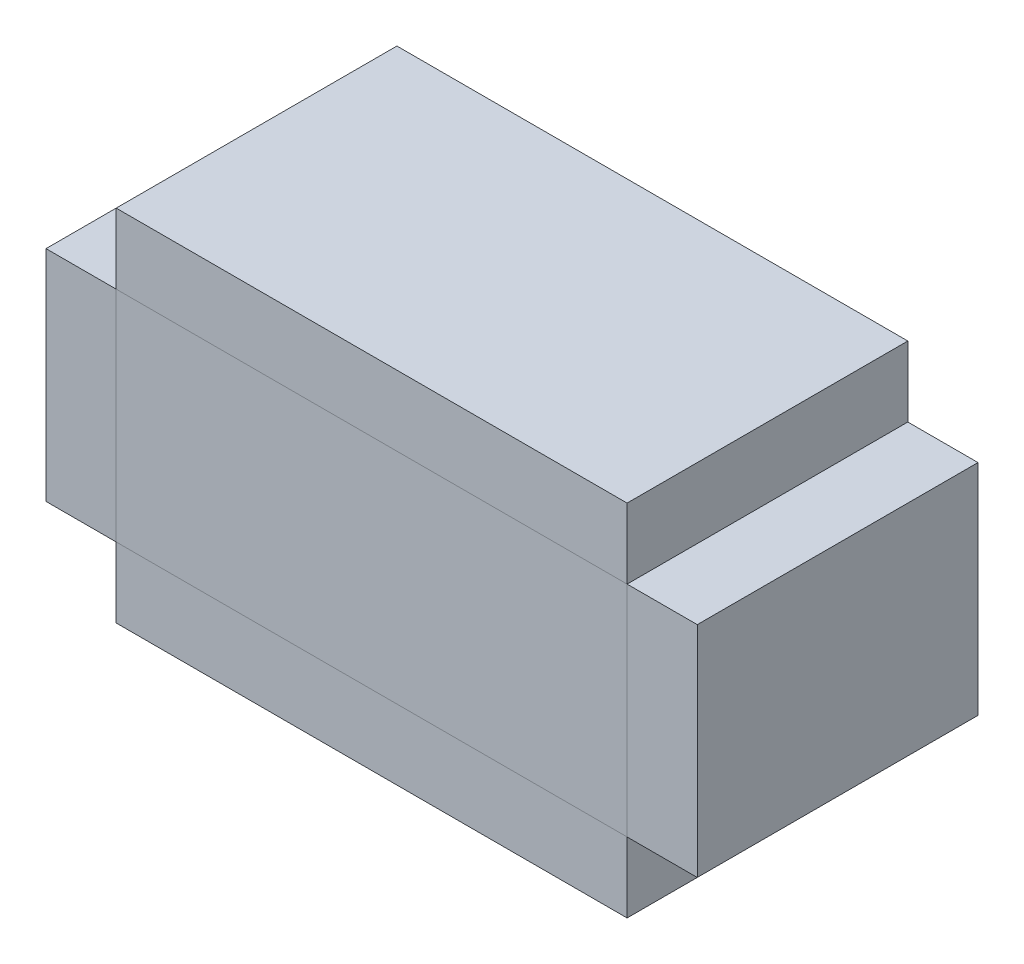
ISO-10303-21;
HEADER;
FILE_DESCRIPTION(('STEP AP214'),'2;1');
FILE_NAME('part.step','',(''),(''),'','','');
FILE_SCHEMA(('AUTOMOTIVE_DESIGN { 1 0 10303 214 1 1 1 1 }'));
ENDSEC;
DATA;
#1=APPLICATION_CONTEXT('core data for automotive mechanical design processes');
#2=APPLICATION_PROTOCOL_DEFINITION('international standard','automotive_design',2000,#1);
#3=PRODUCT_CONTEXT('',#1,'mechanical');
#4=PRODUCT('Part','Part','',(#3));
#5=PRODUCT_RELATED_PRODUCT_CATEGORY('part','',(#4));
#6=PRODUCT_DEFINITION_FORMATION('','',#4);
#7=PRODUCT_DEFINITION_CONTEXT('part definition',#1,'design');
#8=PRODUCT_DEFINITION('design','',#6,#7);
#9=PRODUCT_DEFINITION_SHAPE('','',#8);
#10=(LENGTH_UNIT() NAMED_UNIT(*) SI_UNIT(.MILLI.,.METRE.));
#11=(NAMED_UNIT(*) PLANE_ANGLE_UNIT() SI_UNIT($,.RADIAN.));
#12=(NAMED_UNIT(*) SI_UNIT($,.STERADIAN.) SOLID_ANGLE_UNIT());
#13=UNCERTAINTY_MEASURE_WITH_UNIT(LENGTH_MEASURE(1.E-05),#10,'distance_accuracy_value','');
#14=(GEOMETRIC_REPRESENTATION_CONTEXT(3) GLOBAL_UNCERTAINTY_ASSIGNED_CONTEXT((#13)) GLOBAL_UNIT_ASSIGNED_CONTEXT((#10,
#11,#12)) REPRESENTATION_CONTEXT('',''));
#15=CARTESIAN_POINT('',(0.,0.,0.));
#16=DIRECTION('',(0.,0.,1.));
#17=DIRECTION('',(1.,0.,0.));
#18=AXIS2_PLACEMENT_3D('',#15,#16,#17);
#19=CARTESIAN_POINT('',(0.,-15.24,74.2026103680753));
#20=DIRECTION('',(0.,-1.,0.));
#21=DIRECTION('',(0.,0.,-1.));
#22=AXIS2_PLACEMENT_3D('',#19,#20,#21);
#23=PLANE('',#22);
#24=DIRECTION('',(0.,0.,-1.));
#25=VECTOR('',#24,1.);
#26=CARTESIAN_POINT('',(-28.8925,-15.24,74.2026103680753));
#27=LINE('',#26,#25);
#28=CARTESIAN_POINT('',(-28.8925,-15.24,15.875));
#29=VERTEX_POINT('',#28);
#30=CARTESIAN_POINT('',(-28.8925,-15.24,-15.875));
#31=VERTEX_POINT('',#30);
#32=EDGE_CURVE('E120',#29,#31,#27,.T.);
#33=ORIENTED_EDGE('',*,*,#32,.F.);
#34=DIRECTION('',(1.,0.,0.));
#35=VECTOR('',#34,1.);
#36=CARTESIAN_POINT('',(0.,-15.24,15.875));
#37=LINE('',#36,#35);
#38=CARTESIAN_POINT('',(28.8925,-15.24,15.875));
#39=VERTEX_POINT('',#38);
#40=EDGE_CURVE('E65',#29,#39,#37,.T.);
#41=ORIENTED_EDGE('',*,*,#40,.T.);
#42=DIRECTION('',(0.,0.,-1.));
#43=VECTOR('',#42,1.);
#44=CARTESIAN_POINT('',(28.8925,-15.24,74.2026103680753));
#45=LINE('',#44,#43);
#46=CARTESIAN_POINT('',(28.8925,-15.24,-15.875));
#47=VERTEX_POINT('',#46);
#48=EDGE_CURVE('E95',#39,#47,#45,.T.);
#49=ORIENTED_EDGE('',*,*,#48,.T.);
#50=DIRECTION('',(-1.,0.,0.));
#51=VECTOR('',#50,1.);
#52=CARTESIAN_POINT('',(0.,-15.24,-15.875));
#53=LINE('',#52,#51);
#54=EDGE_CURVE('E98',#47,#31,#53,.T.);
#55=ORIENTED_EDGE('',*,*,#54,.T.);
#56=EDGE_LOOP('',(#33,#41,#49,#55));
#57=FACE_BOUND('',#56,.T.);
#58=ADVANCED_FACE('F58',(#57),#23,.F.);
#59=CARTESIAN_POINT('',(-28.8925,0.,74.2026103680753));
#60=DIRECTION('',(1.,0.,0.));
#61=DIRECTION('',(0.,0.,-1.));
#62=AXIS2_PLACEMENT_3D('',#59,#60,#61);
#63=PLANE('',#62);
#64=DIRECTION('',(0.,0.,-1.));
#65=VECTOR('',#64,1.);
#66=CARTESIAN_POINT('',(-28.8925,-23.1775,74.2026103680753));
#67=LINE('',#66,#65);
#68=CARTESIAN_POINT('',(-28.8925,-23.1775,15.875));
#69=VERTEX_POINT('',#68);
#70=CARTESIAN_POINT('',(-28.8925,-23.1775,-15.875));
#71=VERTEX_POINT('',#70);
#72=EDGE_CURVE('E123',#69,#71,#67,.T.);
#73=ORIENTED_EDGE('',*,*,#72,.F.);
#74=DIRECTION('',(0.,1.,0.));
#75=VECTOR('',#74,1.);
#76=CARTESIAN_POINT('',(-28.8925,0.,15.875));
#77=LINE('',#76,#75);
#78=EDGE_CURVE('E72',#69,#29,#77,.T.);
#79=ORIENTED_EDGE('',*,*,#78,.T.);
#80=ORIENTED_EDGE('',*,*,#32,.T.);
#81=DIRECTION('',(0.,-1.,0.));
#82=VECTOR('',#81,1.);
#83=CARTESIAN_POINT('',(-28.8925,0.,-15.875));
#84=LINE('',#83,#82);
#85=EDGE_CURVE('E102',#31,#71,#84,.T.);
#86=ORIENTED_EDGE('',*,*,#85,.T.);
#87=EDGE_LOOP('',(#73,#79,#80,#86));
#88=FACE_BOUND('',#87,.T.);
#89=ADVANCED_FACE('F129',(#88),#63,.F.);
#90=CARTESIAN_POINT('',(0.,-23.1775,74.2026103680753));
#91=DIRECTION('',(0.,1.,0.));
#92=DIRECTION('',(-1.,0.,0.));
#93=AXIS2_PLACEMENT_3D('',#90,#91,#92);
#94=PLANE('',#93);
#95=DIRECTION('',(0.,0.,-1.));
#96=VECTOR('',#95,1.);
#97=CARTESIAN_POINT('',(28.8925,-23.1775,74.2026103680753));
#98=LINE('',#97,#96);
#99=CARTESIAN_POINT('',(28.8925,-23.1775,15.875));
#100=VERTEX_POINT('',#99);
#101=CARTESIAN_POINT('',(28.8925,-23.1775,-15.875));
#102=VERTEX_POINT('',#101);
#103=EDGE_CURVE('E101',#100,#102,#98,.T.);
#104=ORIENTED_EDGE('',*,*,#103,.F.);
#105=DIRECTION('',(-1.,0.,0.));
#106=VECTOR('',#105,1.);
#107=CARTESIAN_POINT('',(0.,-23.1775,15.875));
#108=LINE('',#107,#106);
#109=EDGE_CURVE('E122',#100,#69,#108,.T.);
#110=ORIENTED_EDGE('',*,*,#109,.T.);
#111=ORIENTED_EDGE('',*,*,#72,.T.);
#112=DIRECTION('',(1.,0.,0.));
#113=VECTOR('',#112,1.);
#114=CARTESIAN_POINT('',(0.,-23.1775,-15.875));
#115=LINE('',#114,#113);
#116=EDGE_CURVE('E114',#71,#102,#115,.T.);
#117=ORIENTED_EDGE('',*,*,#116,.T.);
#118=EDGE_LOOP('',(#104,#110,#111,#117));
#119=FACE_BOUND('',#118,.T.);
#120=ADVANCED_FACE('F127',(#119),#94,.F.);
#121=CARTESIAN_POINT('',(28.8925,0.,74.2026103680753));
#122=DIRECTION('',(1.,0.,0.));
#123=DIRECTION('',(0.,0.,-1.));
#124=AXIS2_PLACEMENT_3D('',#121,#122,#123);
#125=PLANE('',#124);
#126=DIRECTION('',(0.,1.,0.));
#127=VECTOR('',#126,1.);
#128=CARTESIAN_POINT('',(28.8925,0.,15.875));
#129=LINE('',#128,#127);
#130=EDGE_CURVE('E12',#100,#39,#129,.T.);
#131=ORIENTED_EDGE('',*,*,#130,.F.);
#132=ORIENTED_EDGE('',*,*,#103,.T.);
#133=DIRECTION('',(0.,-1.,0.));
#134=VECTOR('',#133,1.);
#135=CARTESIAN_POINT('',(28.8925,0.,-15.875));
#136=LINE('',#135,#134);
#137=EDGE_CURVE('E108',#47,#102,#136,.T.);
#138=ORIENTED_EDGE('',*,*,#137,.F.);
#139=ORIENTED_EDGE('',*,*,#48,.F.);
#140=EDGE_LOOP('',(#131,#132,#138,#139));
#141=FACE_BOUND('',#140,.T.);
#142=ADVANCED_FACE('F111',(#141),#125,.T.);
#143=CARTESIAN_POINT('',(0.,0.,-15.875));
#144=DIRECTION('',(0.,0.,-1.));
#145=DIRECTION('',(-1.,0.,0.));
#146=AXIS2_PLACEMENT_3D('',#143,#144,#145);
#147=PLANE('',#146);
#148=ORIENTED_EDGE('',*,*,#54,.F.);
#149=ORIENTED_EDGE('',*,*,#137,.T.);
#150=ORIENTED_EDGE('',*,*,#116,.F.);
#151=ORIENTED_EDGE('',*,*,#85,.F.);
#152=EDGE_LOOP('',(#148,#149,#150,#151));
#153=FACE_BOUND('',#152,.T.);
#154=ADVANCED_FACE('F106',(#153),#147,.T.);
#155=CARTESIAN_POINT('',(0.,0.,15.875));
#156=DIRECTION('',(0.,0.,-1.));
#157=DIRECTION('',(-1.,0.,0.));
#158=AXIS2_PLACEMENT_3D('',#155,#156,#157);
#159=PLANE('',#158);
#160=ORIENTED_EDGE('',*,*,#78,.F.);
#161=ORIENTED_EDGE('',*,*,#109,.F.);
#162=ORIENTED_EDGE('',*,*,#130,.T.);
#163=ORIENTED_EDGE('',*,*,#40,.F.);
#164=EDGE_LOOP('',(#160,#161,#162,#163));
#165=FACE_BOUND('',#164,.T.);
#166=ADVANCED_FACE('F145',(#165),#159,.F.);
#167=CLOSED_SHELL('',(#58,#89,#120,#142,#154,#166));
#168=MANIFOLD_SOLID_BREP('B2',#167);
#169=CARTESIAN_POINT('',(0.,0.,-15.875));
#170=DIRECTION('',(0.,0.,-1.));
#171=DIRECTION('',(-1.,0.,0.));
#172=AXIS2_PLACEMENT_3D('',#169,#170,#171);
#173=PLANE('',#172);
#174=DIRECTION('',(0.,-1.,0.));
#175=VECTOR('',#174,1.);
#176=CARTESIAN_POINT('',(-36.83,0.,-15.875));
#177=LINE('',#176,#175);
#178=CARTESIAN_POINT('',(-36.83,9.525,-15.875));
#179=VERTEX_POINT('',#178);
#180=CARTESIAN_POINT('',(-36.83,-15.24,-15.875));
#181=VERTEX_POINT('',#180);
#182=EDGE_CURVE('E250',#179,#181,#177,.T.);
#183=ORIENTED_EDGE('',*,*,#182,.F.);
#184=DIRECTION('',(-1.,0.,0.));
#185=VECTOR('',#184,1.);
#186=CARTESIAN_POINT('',(0.,9.525,-15.875));
#187=LINE('',#186,#185);
#188=CARTESIAN_POINT('',(-28.8925,9.525,-15.875));
#189=VERTEX_POINT('',#188);
#190=EDGE_CURVE('E256',#189,#179,#187,.T.);
#191=ORIENTED_EDGE('',*,*,#190,.F.);
#192=DIRECTION('',(0.,1.,0.));
#193=VECTOR('',#192,1.);
#194=CARTESIAN_POINT('',(-28.8925,0.,-15.875));
#195=LINE('',#194,#193);
#196=CARTESIAN_POINT('',(-28.8925,-15.24,-15.875));
#197=VERTEX_POINT('',#196);
#198=EDGE_CURVE('E262',#197,#189,#195,.T.);
#199=ORIENTED_EDGE('',*,*,#198,.F.);
#200=DIRECTION('',(-1.,0.,0.));
#201=VECTOR('',#200,1.);
#202=CARTESIAN_POINT('',(0.,-15.24,-15.875));
#203=LINE('',#202,#201);
#204=EDGE_CURVE('E254',#197,#181,#203,.T.);
#205=ORIENTED_EDGE('',*,*,#204,.T.);
#206=EDGE_LOOP('',(#183,#191,#199,#205));
#207=FACE_BOUND('',#206,.T.);
#208=ADVANCED_FACE('F207',(#207),#173,.T.);
#209=CARTESIAN_POINT('',(0.,9.525,74.2026103680753));
#210=DIRECTION('',(0.,-1.,0.));
#211=DIRECTION('',(0.,0.,-1.));
#212=AXIS2_PLACEMENT_3D('',#209,#210,#211);
#213=PLANE('',#212);
#214=DIRECTION('',(0.,0.,-1.));
#215=VECTOR('',#214,1.);
#216=CARTESIAN_POINT('',(-36.83,9.525,74.2026103680753));
#217=LINE('',#216,#215);
#218=CARTESIAN_POINT('',(-36.83,9.525,15.875));
#219=VERTEX_POINT('',#218);
#220=EDGE_CURVE('E246',#219,#179,#217,.T.);
#221=ORIENTED_EDGE('',*,*,#220,.F.);
#222=DIRECTION('',(1.,0.,0.));
#223=VECTOR('',#222,1.);
#224=CARTESIAN_POINT('',(0.,9.525,15.875));
#225=LINE('',#224,#223);
#226=CARTESIAN_POINT('',(-28.8925,9.525,15.875));
#227=VERTEX_POINT('',#226);
#228=EDGE_CURVE('E211',#219,#227,#225,.T.);
#229=ORIENTED_EDGE('',*,*,#228,.T.);
#230=DIRECTION('',(0.,0.,-1.));
#231=VECTOR('',#230,1.);
#232=CARTESIAN_POINT('',(-28.8925,9.525,74.2026103680753));
#233=LINE('',#232,#231);
#234=EDGE_CURVE('E253',#227,#189,#233,.T.);
#235=ORIENTED_EDGE('',*,*,#234,.T.);
#236=ORIENTED_EDGE('',*,*,#190,.T.);
#237=EDGE_LOOP('',(#221,#229,#235,#236));
#238=FACE_BOUND('',#237,.T.);
#239=ADVANCED_FACE('F257',(#238),#213,.F.);
#240=CARTESIAN_POINT('',(-28.8925,0.,74.2026103680753));
#241=DIRECTION('',(-1.,0.,0.));
#242=DIRECTION('',(0.,-1.,0.));
#243=AXIS2_PLACEMENT_3D('',#240,#241,#242);
#244=PLANE('',#243);
#245=ORIENTED_EDGE('',*,*,#234,.F.);
#246=DIRECTION('',(0.,-1.,0.));
#247=VECTOR('',#246,1.);
#248=CARTESIAN_POINT('',(-28.8925,0.,15.875));
#249=LINE('',#248,#247);
#250=CARTESIAN_POINT('',(-28.8925,-15.24,15.875));
#251=VERTEX_POINT('',#250);
#252=EDGE_CURVE('E277',#227,#251,#249,.T.);
#253=ORIENTED_EDGE('',*,*,#252,.T.);
#254=DIRECTION('',(0.,0.,-1.));
#255=VECTOR('',#254,1.);
#256=CARTESIAN_POINT('',(-28.8925,-15.24,74.2026103680753));
#257=LINE('',#256,#255);
#258=EDGE_CURVE('E272',#251,#197,#257,.T.);
#259=ORIENTED_EDGE('',*,*,#258,.T.);
#260=ORIENTED_EDGE('',*,*,#198,.T.);
#261=EDGE_LOOP('',(#245,#253,#259,#260));
#262=FACE_BOUND('',#261,.T.);
#263=ADVANCED_FACE('F276',(#262),#244,.F.);
#264=CARTESIAN_POINT('',(0.,-15.24,74.2026103680753));
#265=DIRECTION('',(0.,-1.,0.));
#266=DIRECTION('',(0.,0.,-1.));
#267=AXIS2_PLACEMENT_3D('',#264,#265,#266);
#268=PLANE('',#267);
#269=DIRECTION('',(1.,0.,0.));
#270=VECTOR('',#269,1.);
#271=CARTESIAN_POINT('',(0.,-15.24,15.875));
#272=LINE('',#271,#270);
#273=CARTESIAN_POINT('',(-36.83,-15.24,15.875));
#274=VERTEX_POINT('',#273);
#275=EDGE_CURVE('E216',#274,#251,#272,.T.);
#276=ORIENTED_EDGE('',*,*,#275,.F.);
#277=DIRECTION('',(0.,0.,-1.));
#278=VECTOR('',#277,1.);
#279=CARTESIAN_POINT('',(-36.83,-15.24,74.2026103680753));
#280=LINE('',#279,#278);
#281=EDGE_CURVE('E270',#274,#181,#280,.T.);
#282=ORIENTED_EDGE('',*,*,#281,.T.);
#283=ORIENTED_EDGE('',*,*,#204,.F.);
#284=ORIENTED_EDGE('',*,*,#258,.F.);
#285=EDGE_LOOP('',(#276,#282,#283,#284));
#286=FACE_BOUND('',#285,.T.);
#287=ADVANCED_FACE('F279',(#286),#268,.T.);
#288=CARTESIAN_POINT('',(-36.83,0.,74.2026103680753));
#289=DIRECTION('',(1.,0.,0.));
#290=DIRECTION('',(0.,0.,-1.));
#291=AXIS2_PLACEMENT_3D('',#288,#289,#290);
#292=PLANE('',#291);
#293=ORIENTED_EDGE('',*,*,#281,.F.);
#294=DIRECTION('',(0.,1.,0.));
#295=VECTOR('',#294,1.);
#296=CARTESIAN_POINT('',(-36.83,0.,15.875));
#297=LINE('',#296,#295);
#298=EDGE_CURVE('E56',#274,#219,#297,.T.);
#299=ORIENTED_EDGE('',*,*,#298,.T.);
#300=ORIENTED_EDGE('',*,*,#220,.T.);
#301=ORIENTED_EDGE('',*,*,#182,.T.);
#302=EDGE_LOOP('',(#293,#299,#300,#301));
#303=FACE_BOUND('',#302,.T.);
#304=ADVANCED_FACE('F209',(#303),#292,.F.);
#305=CARTESIAN_POINT('',(0.,0.,15.875));
#306=DIRECTION('',(0.,0.,-1.));
#307=DIRECTION('',(-1.,0.,0.));
#308=AXIS2_PLACEMENT_3D('',#305,#306,#307);
#309=PLANE('',#308);
#310=ORIENTED_EDGE('',*,*,#275,.T.);
#311=ORIENTED_EDGE('',*,*,#252,.F.);
#312=ORIENTED_EDGE('',*,*,#228,.F.);
#313=ORIENTED_EDGE('',*,*,#298,.F.);
#314=EDGE_LOOP('',(#310,#311,#312,#313));
#315=FACE_BOUND('',#314,.T.);
#316=ADVANCED_FACE('F287',(#315),#309,.F.);
#317=CLOSED_SHELL('',(#208,#239,#263,#287,#304,#316));
#318=MANIFOLD_SOLID_BREP('B6',#317);
#319=CARTESIAN_POINT('',(0.,9.525,74.2026103680753));
#320=DIRECTION('',(0.,1.,0.));
#321=DIRECTION('',(0.,0.,1.));
#322=AXIS2_PLACEMENT_3D('',#319,#320,#321);
#323=PLANE('',#322);
#324=DIRECTION('',(0.,0.,-1.));
#325=VECTOR('',#324,1.);
#326=CARTESIAN_POINT('',(28.8925,9.525,74.2026103680753));
#327=LINE('',#326,#325);
#328=CARTESIAN_POINT('',(28.8925,9.525,15.875));
#329=VERTEX_POINT('',#328);
#330=CARTESIAN_POINT('',(28.8925,9.525,-15.875));
#331=VERTEX_POINT('',#330);
#332=EDGE_CURVE('E418',#329,#331,#327,.T.);
#333=ORIENTED_EDGE('',*,*,#332,.F.);
#334=DIRECTION('',(-1.,0.,0.));
#335=VECTOR('',#334,1.);
#336=CARTESIAN_POINT('',(0.,9.525,15.875));
#337=LINE('',#336,#335);
#338=CARTESIAN_POINT('',(-28.8925,9.525,15.875));
#339=VERTEX_POINT('',#338);
#340=EDGE_CURVE('E363',#329,#339,#337,.T.);
#341=ORIENTED_EDGE('',*,*,#340,.T.);
#342=DIRECTION('',(0.,0.,-1.));
#343=VECTOR('',#342,1.);
#344=CARTESIAN_POINT('',(-28.8925,9.525,74.2026103680753));
#345=LINE('',#344,#343);
#346=CARTESIAN_POINT('',(-28.8925,9.525,-15.875));
#347=VERTEX_POINT('',#346);
#348=EDGE_CURVE('E393',#339,#347,#345,.T.);
#349=ORIENTED_EDGE('',*,*,#348,.T.);
#350=DIRECTION('',(1.,0.,0.));
#351=VECTOR('',#350,1.);
#352=CARTESIAN_POINT('',(0.,9.525,-15.875));
#353=LINE('',#352,#351);
#354=EDGE_CURVE('E396',#347,#331,#353,.T.);
#355=ORIENTED_EDGE('',*,*,#354,.T.);
#356=EDGE_LOOP('',(#333,#341,#349,#355));
#357=FACE_BOUND('',#356,.T.);
#358=ADVANCED_FACE('F356',(#357),#323,.F.);
#359=CARTESIAN_POINT('',(28.8925,0.,74.2026103680753));
#360=DIRECTION('',(-1.,0.,0.));
#361=DIRECTION('',(0.,0.,1.));
#362=AXIS2_PLACEMENT_3D('',#359,#360,#361);
#363=PLANE('',#362);
#364=DIRECTION('',(0.,0.,-1.));
#365=VECTOR('',#364,1.);
#366=CARTESIAN_POINT('',(28.8925,17.4625,74.2026103680753));
#367=LINE('',#366,#365);
#368=CARTESIAN_POINT('',(28.8925,17.4625,15.875));
#369=VERTEX_POINT('',#368);
#370=CARTESIAN_POINT('',(28.8925,17.4625,-15.875));
#371=VERTEX_POINT('',#370);
#372=EDGE_CURVE('E421',#369,#371,#367,.T.);
#373=ORIENTED_EDGE('',*,*,#372,.F.);
#374=DIRECTION('',(0.,-1.,0.));
#375=VECTOR('',#374,1.);
#376=CARTESIAN_POINT('',(28.8925,0.,15.875));
#377=LINE('',#376,#375);
#378=EDGE_CURVE('E370',#369,#329,#377,.T.);
#379=ORIENTED_EDGE('',*,*,#378,.T.);
#380=ORIENTED_EDGE('',*,*,#332,.T.);
#381=DIRECTION('',(0.,1.,0.));
#382=VECTOR('',#381,1.);
#383=CARTESIAN_POINT('',(28.8925,0.,-15.875));
#384=LINE('',#383,#382);
#385=EDGE_CURVE('E400',#331,#371,#384,.T.);
#386=ORIENTED_EDGE('',*,*,#385,.T.);
#387=EDGE_LOOP('',(#373,#379,#380,#386));
#388=FACE_BOUND('',#387,.T.);
#389=ADVANCED_FACE('F427',(#388),#363,.F.);
#390=CARTESIAN_POINT('',(0.,17.4625,74.2026103680753));
#391=DIRECTION('',(0.,-1.,0.));
#392=DIRECTION('',(0.,0.,-1.));
#393=AXIS2_PLACEMENT_3D('',#390,#391,#392);
#394=PLANE('',#393);
#395=DIRECTION('',(0.,0.,-1.));
#396=VECTOR('',#395,1.);
#397=CARTESIAN_POINT('',(-28.8925,17.4625,74.2026103680753));
#398=LINE('',#397,#396);
#399=CARTESIAN_POINT('',(-28.8925,17.4625,15.875));
#400=VERTEX_POINT('',#399);
#401=CARTESIAN_POINT('',(-28.8925,17.4625,-15.875));
#402=VERTEX_POINT('',#401);
#403=EDGE_CURVE('E399',#400,#402,#398,.T.);
#404=ORIENTED_EDGE('',*,*,#403,.F.);
#405=DIRECTION('',(1.,0.,0.));
#406=VECTOR('',#405,1.);
#407=CARTESIAN_POINT('',(0.,17.4625,15.875));
#408=LINE('',#407,#406);
#409=EDGE_CURVE('E420',#400,#369,#408,.T.);
#410=ORIENTED_EDGE('',*,*,#409,.T.);
#411=ORIENTED_EDGE('',*,*,#372,.T.);
#412=DIRECTION('',(-1.,0.,0.));
#413=VECTOR('',#412,1.);
#414=CARTESIAN_POINT('',(0.,17.4625,-15.875));
#415=LINE('',#414,#413);
#416=EDGE_CURVE('E412',#371,#402,#415,.T.);
#417=ORIENTED_EDGE('',*,*,#416,.T.);
#418=EDGE_LOOP('',(#404,#410,#411,#417));
#419=FACE_BOUND('',#418,.T.);
#420=ADVANCED_FACE('F425',(#419),#394,.F.);
#421=CARTESIAN_POINT('',(-28.8925,0.,74.2026103680753));
#422=DIRECTION('',(-1.,0.,0.));
#423=DIRECTION('',(0.,-1.,0.));
#424=AXIS2_PLACEMENT_3D('',#421,#422,#423);
#425=PLANE('',#424);
#426=DIRECTION('',(0.,-1.,0.));
#427=VECTOR('',#426,1.);
#428=CARTESIAN_POINT('',(-28.8925,0.,15.875));
#429=LINE('',#428,#427);
#430=EDGE_CURVE('E205',#400,#339,#429,.T.);
#431=ORIENTED_EDGE('',*,*,#430,.F.);
#432=ORIENTED_EDGE('',*,*,#403,.T.);
#433=DIRECTION('',(0.,1.,0.));
#434=VECTOR('',#433,1.);
#435=CARTESIAN_POINT('',(-28.8925,0.,-15.875));
#436=LINE('',#435,#434);
#437=EDGE_CURVE('E406',#347,#402,#436,.T.);
#438=ORIENTED_EDGE('',*,*,#437,.F.);
#439=ORIENTED_EDGE('',*,*,#348,.F.);
#440=EDGE_LOOP('',(#431,#432,#438,#439));
#441=FACE_BOUND('',#440,.T.);
#442=ADVANCED_FACE('F409',(#441),#425,.T.);
#443=CARTESIAN_POINT('',(0.,0.,-15.875));
#444=DIRECTION('',(0.,0.,-1.));
#445=DIRECTION('',(-1.,0.,0.));
#446=AXIS2_PLACEMENT_3D('',#443,#444,#445);
#447=PLANE('',#446);
#448=ORIENTED_EDGE('',*,*,#354,.F.);
#449=ORIENTED_EDGE('',*,*,#437,.T.);
#450=ORIENTED_EDGE('',*,*,#416,.F.);
#451=ORIENTED_EDGE('',*,*,#385,.F.);
#452=EDGE_LOOP('',(#448,#449,#450,#451));
#453=FACE_BOUND('',#452,.T.);
#454=ADVANCED_FACE('F404',(#453),#447,.T.);
#455=CARTESIAN_POINT('',(0.,0.,15.875));
#456=DIRECTION('',(0.,0.,-1.));
#457=DIRECTION('',(-1.,0.,0.));
#458=AXIS2_PLACEMENT_3D('',#455,#456,#457);
#459=PLANE('',#458);
#460=ORIENTED_EDGE('',*,*,#378,.F.);
#461=ORIENTED_EDGE('',*,*,#409,.F.);
#462=ORIENTED_EDGE('',*,*,#430,.T.);
#463=ORIENTED_EDGE('',*,*,#340,.F.);
#464=EDGE_LOOP('',(#460,#461,#462,#463));
#465=FACE_BOUND('',#464,.T.);
#466=ADVANCED_FACE('F443',(#465),#459,.F.);
#467=CLOSED_SHELL('',(#358,#389,#420,#442,#454,#466));
#468=MANIFOLD_SOLID_BREP('B50',#467);
#469=CARTESIAN_POINT('',(0.,0.,-15.875));
#470=DIRECTION('',(0.,0.,-1.));
#471=DIRECTION('',(-1.,0.,0.));
#472=AXIS2_PLACEMENT_3D('',#469,#470,#471);
#473=PLANE('',#472);
#474=DIRECTION('',(0.,1.,0.));
#475=VECTOR('',#474,1.);
#476=CARTESIAN_POINT('',(36.83,0.,-15.875));
#477=LINE('',#476,#475);
#478=CARTESIAN_POINT('',(36.83,-15.24,-15.875));
#479=VERTEX_POINT('',#478);
#480=CARTESIAN_POINT('',(36.83,9.525,-15.875));
#481=VERTEX_POINT('',#480);
#482=EDGE_CURVE('E547',#479,#481,#477,.T.);
#483=ORIENTED_EDGE('',*,*,#482,.F.);
#484=DIRECTION('',(1.,0.,0.));
#485=VECTOR('',#484,1.);
#486=CARTESIAN_POINT('',(0.,-15.24,-15.875));
#487=LINE('',#486,#485);
#488=CARTESIAN_POINT('',(28.8925,-15.24,-15.875));
#489=VERTEX_POINT('',#488);
#490=EDGE_CURVE('E553',#489,#479,#487,.T.);
#491=ORIENTED_EDGE('',*,*,#490,.F.);
#492=DIRECTION('',(0.,-1.,0.));
#493=VECTOR('',#492,1.);
#494=CARTESIAN_POINT('',(28.8925,0.,-15.875));
#495=LINE('',#494,#493);
#496=CARTESIAN_POINT('',(28.8925,9.525,-15.875));
#497=VERTEX_POINT('',#496);
#498=EDGE_CURVE('E559',#497,#489,#495,.T.);
#499=ORIENTED_EDGE('',*,*,#498,.F.);
#500=DIRECTION('',(1.,0.,0.));
#501=VECTOR('',#500,1.);
#502=CARTESIAN_POINT('',(0.,9.52500000000001,-15.875));
#503=LINE('',#502,#501);
#504=EDGE_CURVE('E551',#497,#481,#503,.T.);
#505=ORIENTED_EDGE('',*,*,#504,.T.);
#506=EDGE_LOOP('',(#483,#491,#499,#505));
#507=FACE_BOUND('',#506,.T.);
#508=ADVANCED_FACE('F504',(#507),#473,.T.);
#509=CARTESIAN_POINT('',(0.,-15.24,74.2026103680753));
#510=DIRECTION('',(0.,1.,0.));
#511=DIRECTION('',(0.,0.,1.));
#512=AXIS2_PLACEMENT_3D('',#509,#510,#511);
#513=PLANE('',#512);
#514=DIRECTION('',(0.,0.,-1.));
#515=VECTOR('',#514,1.);
#516=CARTESIAN_POINT('',(36.83,-15.24,74.2026103680753));
#517=LINE('',#516,#515);
#518=CARTESIAN_POINT('',(36.83,-15.24,15.875));
#519=VERTEX_POINT('',#518);
#520=EDGE_CURVE('E543',#519,#479,#517,.T.);
#521=ORIENTED_EDGE('',*,*,#520,.F.);
#522=DIRECTION('',(-1.,0.,0.));
#523=VECTOR('',#522,1.);
#524=CARTESIAN_POINT('',(0.,-15.24,15.875));
#525=LINE('',#524,#523);
#526=CARTESIAN_POINT('',(28.8925,-15.24,15.875));
#527=VERTEX_POINT('',#526);
#528=EDGE_CURVE('E508',#519,#527,#525,.T.);
#529=ORIENTED_EDGE('',*,*,#528,.T.);
#530=DIRECTION('',(0.,0.,-1.));
#531=VECTOR('',#530,1.);
#532=CARTESIAN_POINT('',(28.8925,-15.24,74.2026103680753));
#533=LINE('',#532,#531);
#534=EDGE_CURVE('E550',#527,#489,#533,.T.);
#535=ORIENTED_EDGE('',*,*,#534,.T.);
#536=ORIENTED_EDGE('',*,*,#490,.T.);
#537=EDGE_LOOP('',(#521,#529,#535,#536));
#538=FACE_BOUND('',#537,.T.);
#539=ADVANCED_FACE('F554',(#538),#513,.F.);
#540=CARTESIAN_POINT('',(28.8925,0.,74.2026103680753));
#541=DIRECTION('',(1.,0.,0.));
#542=DIRECTION('',(0.,1.,0.));
#543=AXIS2_PLACEMENT_3D('',#540,#541,#542);
#544=PLANE('',#543);
#545=ORIENTED_EDGE('',*,*,#534,.F.);
#546=DIRECTION('',(0.,1.,0.));
#547=VECTOR('',#546,1.);
#548=CARTESIAN_POINT('',(28.8925,0.,15.875));
#549=LINE('',#548,#547);
#550=CARTESIAN_POINT('',(28.8925,9.525,15.875));
#551=VERTEX_POINT('',#550);
#552=EDGE_CURVE('E574',#527,#551,#549,.T.);
#553=ORIENTED_EDGE('',*,*,#552,.T.);
#554=DIRECTION('',(0.,0.,-1.));
#555=VECTOR('',#554,1.);
#556=CARTESIAN_POINT('',(28.8925,9.525,74.2026103680753));
#557=LINE('',#556,#555);
#558=EDGE_CURVE('E569',#551,#497,#557,.T.);
#559=ORIENTED_EDGE('',*,*,#558,.T.);
#560=ORIENTED_EDGE('',*,*,#498,.T.);
#561=EDGE_LOOP('',(#545,#553,#559,#560));
#562=FACE_BOUND('',#561,.T.);
#563=ADVANCED_FACE('F573',(#562),#544,.F.);
#564=CARTESIAN_POINT('',(0.,9.52500000000001,74.2026103680753));
#565=DIRECTION('',(0.,1.,0.));
#566=DIRECTION('',(-1.,0.,0.));
#567=AXIS2_PLACEMENT_3D('',#564,#565,#566);
#568=PLANE('',#567);
#569=DIRECTION('',(-1.,0.,0.));
#570=VECTOR('',#569,1.);
#571=CARTESIAN_POINT('',(0.,9.52500000000001,15.875));
#572=LINE('',#571,#570);
#573=CARTESIAN_POINT('',(36.83,9.525,15.875));
#574=VERTEX_POINT('',#573);
#575=EDGE_CURVE('E513',#574,#551,#572,.T.);
#576=ORIENTED_EDGE('',*,*,#575,.F.);
#577=DIRECTION('',(0.,0.,-1.));
#578=VECTOR('',#577,1.);
#579=CARTESIAN_POINT('',(36.83,9.525,74.2026103680753));
#580=LINE('',#579,#578);
#581=EDGE_CURVE('E567',#574,#481,#580,.T.);
#582=ORIENTED_EDGE('',*,*,#581,.T.);
#583=ORIENTED_EDGE('',*,*,#504,.F.);
#584=ORIENTED_EDGE('',*,*,#558,.F.);
#585=EDGE_LOOP('',(#576,#582,#583,#584));
#586=FACE_BOUND('',#585,.T.);
#587=ADVANCED_FACE('F576',(#586),#568,.T.);
#588=CARTESIAN_POINT('',(36.83,0.,74.2026103680753));
#589=DIRECTION('',(-1.,0.,0.));
#590=DIRECTION('',(0.,0.,1.));
#591=AXIS2_PLACEMENT_3D('',#588,#589,#590);
#592=PLANE('',#591);
#593=ORIENTED_EDGE('',*,*,#581,.F.);
#594=DIRECTION('',(0.,-1.,0.));
#595=VECTOR('',#594,1.);
#596=CARTESIAN_POINT('',(36.83,0.,15.875));
#597=LINE('',#596,#595);
#598=EDGE_CURVE('E354',#574,#519,#597,.T.);
#599=ORIENTED_EDGE('',*,*,#598,.T.);
#600=ORIENTED_EDGE('',*,*,#520,.T.);
#601=ORIENTED_EDGE('',*,*,#482,.T.);
#602=EDGE_LOOP('',(#593,#599,#600,#601));
#603=FACE_BOUND('',#602,.T.);
#604=ADVANCED_FACE('F506',(#603),#592,.F.);
#605=CARTESIAN_POINT('',(0.,0.,15.875));
#606=DIRECTION('',(0.,0.,-1.));
#607=DIRECTION('',(-1.,0.,0.));
#608=AXIS2_PLACEMENT_3D('',#605,#606,#607);
#609=PLANE('',#608);
#610=ORIENTED_EDGE('',*,*,#575,.T.);
#611=ORIENTED_EDGE('',*,*,#552,.F.);
#612=ORIENTED_EDGE('',*,*,#528,.F.);
#613=ORIENTED_EDGE('',*,*,#598,.F.);
#614=EDGE_LOOP('',(#610,#611,#612,#613));
#615=FACE_BOUND('',#614,.T.);
#616=ADVANCED_FACE('F584',(#615),#609,.F.);
#617=CLOSED_SHELL('',(#508,#539,#563,#587,#604,#616));
#618=MANIFOLD_SOLID_BREP('B199',#617);
#619=CARTESIAN_POINT('',(-28.8925,-15.24,-15.875));
#620=DIRECTION('',(-1.,0.,0.));
#621=DIRECTION('',(0.,-1.,0.));
#622=AXIS2_PLACEMENT_3D('',#619,#620,#621);
#623=PLANE('',#622);
#624=DIRECTION('',(0.,-1.,0.));
#625=VECTOR('',#624,1.);
#626=CARTESIAN_POINT('',(-28.8925,-15.24,15.875));
#627=LINE('',#626,#625);
#628=CARTESIAN_POINT('',(-28.8925,9.525,15.875));
#629=VERTEX_POINT('',#628);
#630=CARTESIAN_POINT('',(-28.8925,-15.24,15.875));
#631=VERTEX_POINT('',#630);
#632=EDGE_CURVE('E713',#629,#631,#627,.T.);
#633=ORIENTED_EDGE('',*,*,#632,.F.);
#634=DIRECTION('',(0.,0.,1.));
#635=VECTOR('',#634,1.);
#636=CARTESIAN_POINT('',(-28.8925,9.525,-15.875));
#637=LINE('',#636,#635);
#638=CARTESIAN_POINT('',(-28.8925,9.525,-15.875));
#639=VERTEX_POINT('',#638);
#640=EDGE_CURVE('E502',#639,#629,#637,.T.);
#641=ORIENTED_EDGE('',*,*,#640,.F.);
#642=DIRECTION('',(0.,-1.,0.));
#643=VECTOR('',#642,1.);
#644=CARTESIAN_POINT('',(-28.8925,-15.24,-15.875));
#645=LINE('',#644,#643);
#646=CARTESIAN_POINT('',(-28.8925,-15.24,-15.875));
#647=VERTEX_POINT('',#646);
#648=EDGE_CURVE('E705',#639,#647,#645,.T.);
#649=ORIENTED_EDGE('',*,*,#648,.T.);
#650=DIRECTION('',(0.,0.,1.));
#651=VECTOR('',#650,1.);
#652=CARTESIAN_POINT('',(-28.8925,-15.24,-15.875));
#653=LINE('',#652,#651);
#654=EDGE_CURVE('E646',#647,#631,#653,.T.);
#655=ORIENTED_EDGE('',*,*,#654,.T.);
#656=EDGE_LOOP('',(#633,#641,#649,#655));
#657=FACE_BOUND('',#656,.T.);
#658=ADVANCED_FACE('F643',(#657),#623,.T.);
#659=CARTESIAN_POINT('',(-28.8925,9.525,-15.875));
#660=DIRECTION('',(0.,1.,0.));
#661=DIRECTION('',(0.,0.,1.));
#662=AXIS2_PLACEMENT_3D('',#659,#660,#661);
#663=PLANE('',#662);
#664=DIRECTION('',(-1.,0.,0.));
#665=VECTOR('',#664,1.);
#666=CARTESIAN_POINT('',(-28.8925,9.525,15.875));
#667=LINE('',#666,#665);
#668=CARTESIAN_POINT('',(28.8925,9.525,15.875));
#669=VERTEX_POINT('',#668);
#670=EDGE_CURVE('E708',#669,#629,#667,.T.);
#671=ORIENTED_EDGE('',*,*,#670,.F.);
#672=DIRECTION('',(0.,0.,1.));
#673=VECTOR('',#672,1.);
#674=CARTESIAN_POINT('',(28.8925,9.525,-15.875));
#675=LINE('',#674,#673);
#676=CARTESIAN_POINT('',(28.8925,9.525,-15.875));
#677=VERTEX_POINT('',#676);
#678=EDGE_CURVE('E653',#677,#669,#675,.T.);
#679=ORIENTED_EDGE('',*,*,#678,.F.);
#680=DIRECTION('',(-1.,0.,0.));
#681=VECTOR('',#680,1.);
#682=CARTESIAN_POINT('',(-28.8925,9.525,-15.875));
#683=LINE('',#682,#681);
#684=EDGE_CURVE('E700',#677,#639,#683,.T.);
#685=ORIENTED_EDGE('',*,*,#684,.T.);
#686=ORIENTED_EDGE('',*,*,#640,.T.);
#687=EDGE_LOOP('',(#671,#679,#685,#686));
#688=FACE_BOUND('',#687,.T.);
#689=ADVANCED_FACE('F729',(#688),#663,.T.);
#690=CARTESIAN_POINT('',(28.8925,-15.24,-15.875));
#691=DIRECTION('',(1.,0.,0.));
#692=DIRECTION('',(0.,1.,0.));
#693=AXIS2_PLACEMENT_3D('',#690,#691,#692);
#694=PLANE('',#693);
#695=DIRECTION('',(0.,1.,0.));
#696=VECTOR('',#695,1.);
#697=CARTESIAN_POINT('',(28.8925,-15.24,15.875));
#698=LINE('',#697,#696);
#699=CARTESIAN_POINT('',(28.8925,-15.24,15.875));
#700=VERTEX_POINT('',#699);
#701=EDGE_CURVE('E694',#700,#669,#698,.T.);
#702=ORIENTED_EDGE('',*,*,#701,.F.);
#703=DIRECTION('',(0.,0.,1.));
#704=VECTOR('',#703,1.);
#705=CARTESIAN_POINT('',(28.8925,-15.24,-15.875));
#706=LINE('',#705,#704);
#707=CARTESIAN_POINT('',(28.8925,-15.24,-15.875));
#708=VERTEX_POINT('',#707);
#709=EDGE_CURVE('E689',#708,#700,#706,.T.);
#710=ORIENTED_EDGE('',*,*,#709,.F.);
#711=DIRECTION('',(0.,1.,0.));
#712=VECTOR('',#711,1.);
#713=CARTESIAN_POINT('',(28.8925,-15.24,-15.875));
#714=LINE('',#713,#712);
#715=EDGE_CURVE('E692',#708,#677,#714,.T.);
#716=ORIENTED_EDGE('',*,*,#715,.T.);
#717=ORIENTED_EDGE('',*,*,#678,.T.);
#718=EDGE_LOOP('',(#702,#710,#716,#717));
#719=FACE_BOUND('',#718,.T.);
#720=ADVANCED_FACE('F691',(#719),#694,.T.);
#721=CARTESIAN_POINT('',(-28.8925,-15.24,-15.875));
#722=DIRECTION('',(0.,-1.,0.));
#723=DIRECTION('',(0.,0.,-1.));
#724=AXIS2_PLACEMENT_3D('',#721,#722,#723);
#725=PLANE('',#724);
#726=DIRECTION('',(1.,0.,0.));
#727=VECTOR('',#726,1.);
#728=CARTESIAN_POINT('',(-28.8925,-15.24,15.875));
#729=LINE('',#728,#727);
#730=EDGE_CURVE('E717',#631,#700,#729,.T.);
#731=ORIENTED_EDGE('',*,*,#730,.F.);
#732=ORIENTED_EDGE('',*,*,#654,.F.);
#733=DIRECTION('',(1.,0.,0.));
#734=VECTOR('',#733,1.);
#735=CARTESIAN_POINT('',(-28.8925,-15.24,-15.875));
#736=LINE('',#735,#734);
#737=EDGE_CURVE('E699',#647,#708,#736,.T.);
#738=ORIENTED_EDGE('',*,*,#737,.T.);
#739=ORIENTED_EDGE('',*,*,#709,.T.);
#740=EDGE_LOOP('',(#731,#732,#738,#739));
#741=FACE_BOUND('',#740,.T.);
#742=ADVANCED_FACE('F703',(#741),#725,.T.);
#743=CARTESIAN_POINT('',(0.,0.,-15.875));
#744=DIRECTION('',(0.,0.,-1.));
#745=DIRECTION('',(-1.,0.,0.));
#746=AXIS2_PLACEMENT_3D('',#743,#744,#745);
#747=PLANE('',#746);
#748=ORIENTED_EDGE('',*,*,#648,.F.);
#749=ORIENTED_EDGE('',*,*,#684,.F.);
#750=ORIENTED_EDGE('',*,*,#715,.F.);
#751=ORIENTED_EDGE('',*,*,#737,.F.);
#752=EDGE_LOOP('',(#748,#749,#750,#751));
#753=FACE_BOUND('',#752,.T.);
#754=ADVANCED_FACE('F698',(#753),#747,.T.);
#755=CARTESIAN_POINT('',(0.,0.,15.875));
#756=DIRECTION('',(0.,0.,-1.));
#757=DIRECTION('',(-1.,0.,0.));
#758=AXIS2_PLACEMENT_3D('',#755,#756,#757);
#759=PLANE('',#758);
#760=ORIENTED_EDGE('',*,*,#632,.T.);
#761=ORIENTED_EDGE('',*,*,#730,.T.);
#762=ORIENTED_EDGE('',*,*,#701,.T.);
#763=ORIENTED_EDGE('',*,*,#670,.T.);
#764=EDGE_LOOP('',(#760,#761,#762,#763));
#765=FACE_BOUND('',#764,.T.);
#766=ADVANCED_FACE('F728',(#765),#759,.F.);
#767=CLOSED_SHELL('',(#658,#689,#720,#742,#754,#766));
#768=MANIFOLD_SOLID_BREP('B348',#767);
#769=ADVANCED_BREP_SHAPE_REPRESENTATION('',(#18,#168,#318,#468,#618,#768),#14);
#770=SHAPE_DEFINITION_REPRESENTATION(#9,#769);
ENDSEC;
END-ISO-10303-21;
